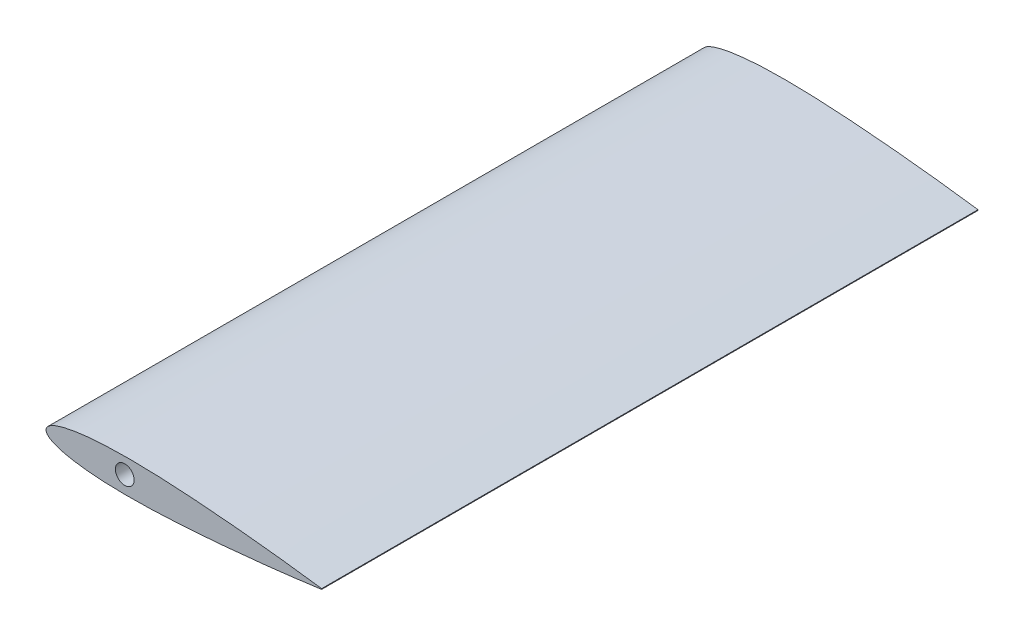
ISO-10303-21;
HEADER;
FILE_DESCRIPTION(('STEP AP214'),'2;1');
FILE_NAME('part.step','',(''),(''),'','','');
FILE_SCHEMA(('AUTOMOTIVE_DESIGN { 1 0 10303 214 1 1 1 1 }'));
ENDSEC;
DATA;
#1=APPLICATION_CONTEXT('core data for automotive mechanical design processes');
#2=APPLICATION_PROTOCOL_DEFINITION('international standard','automotive_design',2000,#1);
#3=PRODUCT_CONTEXT('',#1,'mechanical');
#4=PRODUCT('Part','Part','',(#3));
#5=PRODUCT_RELATED_PRODUCT_CATEGORY('part','',(#4));
#6=PRODUCT_DEFINITION_FORMATION('','',#4);
#7=PRODUCT_DEFINITION_CONTEXT('part definition',#1,'design');
#8=PRODUCT_DEFINITION('design','',#6,#7);
#9=PRODUCT_DEFINITION_SHAPE('','',#8);
#10=(LENGTH_UNIT() NAMED_UNIT(*) SI_UNIT(.MILLI.,.METRE.));
#11=(NAMED_UNIT(*) PLANE_ANGLE_UNIT() SI_UNIT($,.RADIAN.));
#12=(NAMED_UNIT(*) SI_UNIT($,.STERADIAN.) SOLID_ANGLE_UNIT());
#13=UNCERTAINTY_MEASURE_WITH_UNIT(LENGTH_MEASURE(1.E-05),#10,'distance_accuracy_value','');
#14=(GEOMETRIC_REPRESENTATION_CONTEXT(3) GLOBAL_UNCERTAINTY_ASSIGNED_CONTEXT((#13)) GLOBAL_UNIT_ASSIGNED_CONTEXT((#10,
#11,#12)) REPRESENTATION_CONTEXT('',''));
#15=CARTESIAN_POINT('',(0.,0.,0.));
#16=DIRECTION('',(0.,0.,1.));
#17=DIRECTION('',(1.,0.,0.));
#18=AXIS2_PLACEMENT_3D('',#15,#16,#17);
#19=CARTESIAN_POINT('',(0.999999999999996,-0.030492,70.));
#20=CARTESIAN_POINT('',(0.439107200362805,0.0482916430037762,70.));
#21=CARTESIAN_POINT('',(-1.67440318546743,0.334004631039862,70.));
#22=CARTESIAN_POINT('',(-4.61753075382217,0.68424044281171,70.));
#23=CARTESIAN_POINT('',(-8.13265648574757,1.04666058109571,70.));
#24=CARTESIAN_POINT('',(-10.7979695978863,1.28467991908706,70.));
#25=CARTESIAN_POINT('',(-13.3462125522033,1.47149098632113,70.));
#26=CARTESIAN_POINT('',(-15.4585233955373,1.59430214673583,70.));
#27=CARTESIAN_POINT('',(-17.5341249985783,1.67566708670534,70.));
#28=CARTESIAN_POINT('',(-19.5295919390187,1.70658812428436,70.));
#29=CARTESIAN_POINT('',(-21.218108072518,1.68277080165957,70.));
#30=CARTESIAN_POINT('',(-22.5984962646601,1.6201482803771,70.));
#31=CARTESIAN_POINT('',(-23.6814091095408,1.53967512026883,70.));
#32=CARTESIAN_POINT('',(-24.6713537677688,1.43217562844883,70.));
#33=CARTESIAN_POINT('',(-25.4326813593176,1.31828462141949,70.));
#34=CARTESIAN_POINT('',(-25.9876663950995,1.21315529065949,70.));
#35=CARTESIAN_POINT('',(-26.3624753496774,1.13107874990639,70.));
#36=CARTESIAN_POINT('',(-26.7077655636183,1.04362868292588,70.));
#37=CARTESIAN_POINT('',(-27.0227740532249,0.951196851540344,70.));
#38=CARTESIAN_POINT('',(-27.30680622529,0.854090221485334,70.));
#39=CARTESIAN_POINT('',(-27.5592563657164,0.752644177568336,70.));
#40=CARTESIAN_POINT('',(-27.779624737862,0.647151372552298,70.));
#41=CARTESIAN_POINT('',(-27.9674915113008,0.537831437340606,70.));
#42=CARTESIAN_POINT('',(-28.1226379229612,0.42486969062914,70.));
#43=CARTESIAN_POINT('',(-28.2447641879163,0.308080316766064,70.));
#44=CARTESIAN_POINT('',(-28.3335757952812,0.1871324708287,70.));
#45=CARTESIAN_POINT('',(-28.387875352133,0.0614349740101144,70.));
#46=CARTESIAN_POINT('',(-28.4059100610577,-0.0675360000000003,70.));
#47=CARTESIAN_POINT('',(-28.387875352133,-0.196506974010112,70.));
#48=CARTESIAN_POINT('',(-28.3335757952812,-0.322204470828704,70.));
#49=CARTESIAN_POINT('',(-28.2447641879163,-0.443152316766058,70.));
#50=CARTESIAN_POINT('',(-28.1226379229612,-0.559941690629147,70.));
#51=CARTESIAN_POINT('',(-27.9674915113008,-0.672903437340602,70.));
#52=CARTESIAN_POINT('',(-27.779624737862,-0.782223372552299,70.));
#53=CARTESIAN_POINT('',(-27.5592563657164,-0.887716177568338,70.));
#54=CARTESIAN_POINT('',(-27.30680622529,-0.989162221485334,70.));
#55=CARTESIAN_POINT('',(-27.0227740532249,-1.08626885154034,70.));
#56=CARTESIAN_POINT('',(-26.7077655636183,-1.17870068292588,70.));
#57=CARTESIAN_POINT('',(-26.3624753496774,-1.26615074990639,70.));
#58=CARTESIAN_POINT('',(-25.8453176345296,-1.37939915489957,70.));
#59=CARTESIAN_POINT('',(-25.1285876853691,-1.50394081739461,70.));
#60=CARTESIAN_POINT('',(-24.1885879902536,-1.62425936478125,70.));
#61=CARTESIAN_POINT('',(-22.9535044026313,-1.736332976136,70.));
#62=CARTESIAN_POINT('',(-21.4031558298524,-1.81515251551264,70.));
#63=CARTESIAN_POINT('',(-19.2995446770764,-1.84491037015484,70.));
#64=CARTESIAN_POINT('',(-17.0681292430447,-1.79876702122128,70.));
#65=CARTESIAN_POINT('',(-14.7563271985331,-1.69255987178564,70.));
#66=CARTESIAN_POINT('',(-12.6416051474833,-1.55811383616586,70.));
#67=CARTESIAN_POINT('',(-10.3295124754579,-1.37861378181494,70.));
#68=CARTESIAN_POINT('',(-8.30351639758221,-1.19440739049765,70.));
#69=CARTESIAN_POINT('',(-5.69237571783539,-0.932615266100081,70.));
#70=CARTESIAN_POINT('',(-3.10979309525262,-0.643787719924702,70.));
#71=CARTESIAN_POINT('',(-0.644324125665286,-0.330601025685573,70.));
#72=CARTESIAN_POINT('',(0.586969476350031,-0.162396473693552,70.));
#73=CARTESIAN_POINT('',(0.948583439323904,-0.111802028814434,70.));
#74=CARTESIAN_POINT('',(0.999999999999996,-0.10458,70.));
#75=B_SPLINE_CURVE_WITH_KNOTS('',3,(#19,#20,#21,#22,#23,#24,#25,#26,#27,#28,#29,#30,#31,#32,#33,
#34,#35,#36,#37,#38,#39,#40,#41,#42,#43,#44,#45,#46,#47,#48,#49,#50,#51,#52,#53,#54,#55,#56,#57,
#58,#59,#60,#61,#62,#63,#64,#65,#66,#67,#68,#69,#70,#71,#72,#73,#74),.UNSPECIFIED.,.F.,.F.,(4,1,
1,1,1,1,1,1,1,1,1,1,1,1,1,1,1,1,1,1,1,1,1,1,1,1,1,1,1,1,1,1,1,1,1,1,1,1,1,1,1,1,1,1,1,1,1,1,1,1,
1,1,1,4),(0.,0.0283429008690872,0.106722048517726,0.148306054540842,0.205171366742429,
0.240621400483931,0.276160573352716,0.311047092160121,0.344559265520828,0.376017570419826,
0.395537658905913,0.413698812078543,0.430349273099823,0.445356904422305,0.452209372098903,
0.458611567079498,0.46455404405062,0.470029850192537,0.475034902370301,0.479569141493347,
0.483636857140142,0.487250262770083,0.490431337960153,0.493218828079602,0.495674085869199,
0.497891368316545,0.5,0.502108631683455,0.504325914130801,0.506781171920398,0.509568662039847,
0.512749737229918,0.516363142859858,0.520430858506654,0.524965097629699,0.529970149807464,
0.53544595594938,0.541388432920502,0.547790627901097,0.561933980705176,0.577778558712574,
0.595202023801781,0.623982429580175,0.655440734479173,0.700464146399425,0.735649712925285,
0.771241831243212,0.806495956538878,0.851693945459158,0.873039495246583,0.937813387298575,
0.981728387914688,0.997401830647112,1.),.UNSPECIFIED.);
#76=DIRECTION('',(0.,0.,-1.));
#77=VECTOR('',#76,1.);
#78=SURFACE_OF_LINEAR_EXTRUSION('',#75,#77);
#79=CARTESIAN_POINT('',(0.999999999999996,-0.030492,0.));
#80=CARTESIAN_POINT('',(0.439107200362805,0.0482916430037762,0.));
#81=CARTESIAN_POINT('',(-1.67440318546743,0.334004631039862,0.));
#82=CARTESIAN_POINT('',(-4.61753075382217,0.68424044281171,0.));
#83=CARTESIAN_POINT('',(-8.13265648574757,1.04666058109571,0.));
#84=CARTESIAN_POINT('',(-10.7979695978863,1.28467991908706,0.));
#85=CARTESIAN_POINT('',(-13.3462125522033,1.47149098632113,0.));
#86=CARTESIAN_POINT('',(-15.4585233955373,1.59430214673583,0.));
#87=CARTESIAN_POINT('',(-17.5341249985783,1.67566708670534,0.));
#88=CARTESIAN_POINT('',(-19.5295919390187,1.70658812428436,0.));
#89=CARTESIAN_POINT('',(-21.218108072518,1.68277080165957,0.));
#90=CARTESIAN_POINT('',(-22.5984962646601,1.6201482803771,0.));
#91=CARTESIAN_POINT('',(-23.6814091095408,1.53967512026883,0.));
#92=CARTESIAN_POINT('',(-24.6713537677688,1.43217562844883,0.));
#93=CARTESIAN_POINT('',(-25.4326813593176,1.31828462141949,0.));
#94=CARTESIAN_POINT('',(-25.9876663950995,1.21315529065949,0.));
#95=CARTESIAN_POINT('',(-26.3624753496774,1.13107874990639,0.));
#96=CARTESIAN_POINT('',(-26.7077655636183,1.04362868292588,0.));
#97=CARTESIAN_POINT('',(-27.0227740532249,0.951196851540344,0.));
#98=CARTESIAN_POINT('',(-27.30680622529,0.854090221485334,0.));
#99=CARTESIAN_POINT('',(-27.5592563657164,0.752644177568336,0.));
#100=CARTESIAN_POINT('',(-27.779624737862,0.647151372552298,0.));
#101=CARTESIAN_POINT('',(-27.9674915113008,0.537831437340606,0.));
#102=CARTESIAN_POINT('',(-28.1226379229612,0.42486969062914,0.));
#103=CARTESIAN_POINT('',(-28.2447641879163,0.308080316766064,0.));
#104=CARTESIAN_POINT('',(-28.3335757952812,0.1871324708287,0.));
#105=CARTESIAN_POINT('',(-28.387875352133,0.0614349740101144,0.));
#106=CARTESIAN_POINT('',(-28.4059100610577,-0.0675360000000003,0.));
#107=CARTESIAN_POINT('',(-28.387875352133,-0.196506974010112,0.));
#108=CARTESIAN_POINT('',(-28.3335757952812,-0.322204470828704,0.));
#109=CARTESIAN_POINT('',(-28.2447641879163,-0.443152316766058,0.));
#110=CARTESIAN_POINT('',(-28.1226379229612,-0.559941690629147,0.));
#111=CARTESIAN_POINT('',(-27.9674915113008,-0.672903437340602,0.));
#112=CARTESIAN_POINT('',(-27.779624737862,-0.782223372552299,0.));
#113=CARTESIAN_POINT('',(-27.5592563657164,-0.887716177568338,0.));
#114=CARTESIAN_POINT('',(-27.30680622529,-0.989162221485334,0.));
#115=CARTESIAN_POINT('',(-27.0227740532249,-1.08626885154034,0.));
#116=CARTESIAN_POINT('',(-26.7077655636183,-1.17870068292588,0.));
#117=CARTESIAN_POINT('',(-26.3624753496774,-1.26615074990639,0.));
#118=CARTESIAN_POINT('',(-25.8453176345296,-1.37939915489957,0.));
#119=CARTESIAN_POINT('',(-25.1285876853691,-1.50394081739461,0.));
#120=CARTESIAN_POINT('',(-24.1885879902536,-1.62425936478125,0.));
#121=CARTESIAN_POINT('',(-22.9535044026313,-1.736332976136,0.));
#122=CARTESIAN_POINT('',(-21.4031558298524,-1.81515251551264,0.));
#123=CARTESIAN_POINT('',(-19.2995446770764,-1.84491037015484,0.));
#124=CARTESIAN_POINT('',(-17.0681292430447,-1.79876702122128,0.));
#125=CARTESIAN_POINT('',(-14.7563271985331,-1.69255987178564,0.));
#126=CARTESIAN_POINT('',(-12.6416051474833,-1.55811383616586,0.));
#127=CARTESIAN_POINT('',(-10.3295124754579,-1.37861378181494,0.));
#128=CARTESIAN_POINT('',(-8.30351639758221,-1.19440739049765,0.));
#129=CARTESIAN_POINT('',(-5.69237571783539,-0.932615266100081,0.));
#130=CARTESIAN_POINT('',(-3.10979309525262,-0.643787719924702,0.));
#131=CARTESIAN_POINT('',(-0.644324125665286,-0.330601025685573,0.));
#132=CARTESIAN_POINT('',(0.586969476350031,-0.162396473693552,0.));
#133=CARTESIAN_POINT('',(0.948583439323904,-0.111802028814434,0.));
#134=CARTESIAN_POINT('',(0.999999999999996,-0.10458,0.));
#135=B_SPLINE_CURVE_WITH_KNOTS('',3,(#79,#80,#81,#82,#83,#84,#85,#86,#87,#88,#89,#90,#91,#92,
#93,#94,#95,#96,#97,#98,#99,#100,#101,#102,#103,#104,#105,#106,#107,#108,#109,#110,#111,#112,
#113,#114,#115,#116,#117,#118,#119,#120,#121,#122,#123,#124,#125,#126,#127,#128,#129,#130,#131,
#132,#133,#134),.UNSPECIFIED.,.F.,.F.,(4,1,1,1,1,1,1,1,1,1,1,1,1,1,1,1,1,1,1,1,1,1,1,1,1,1,1,1,
1,1,1,1,1,1,1,1,1,1,1,1,1,1,1,1,1,1,1,1,1,1,1,1,1,4),(0.,0.0283429008690872,0.106722048517726,
0.148306054540842,0.205171366742429,0.240621400483931,0.276160573352716,0.311047092160121,
0.344559265520828,0.376017570419826,0.395537658905913,0.413698812078543,0.430349273099823,
0.445356904422305,0.452209372098903,0.458611567079498,0.46455404405062,0.470029850192537,
0.475034902370301,0.479569141493347,0.483636857140142,0.487250262770083,0.490431337960153,
0.493218828079602,0.495674085869199,0.497891368316545,0.5,0.502108631683455,0.504325914130801,
0.506781171920398,0.509568662039847,0.512749737229918,0.516363142859858,0.520430858506654,
0.524965097629699,0.529970149807464,0.53544595594938,0.541388432920502,0.547790627901097,
0.561933980705176,0.577778558712574,0.595202023801781,0.623982429580175,0.655440734479173,
0.700464146399425,0.735649712925285,0.771241831243212,0.806495956538878,0.851693945459158,
0.873039495246583,0.937813387298575,0.981728387914688,0.997401830647112,1.),.UNSPECIFIED.);
#136=CARTESIAN_POINT('',(0.999999999999996,-0.030492,0.));
#137=VERTEX_POINT('',#136);
#138=CARTESIAN_POINT('',(0.999999999999996,-0.10458,0.));
#139=VERTEX_POINT('',#138);
#140=EDGE_CURVE('E67',#137,#139,#135,.T.);
#141=ORIENTED_EDGE('',*,*,#140,.T.);
#142=DIRECTION('',(0.,0.,-1.));
#143=VECTOR('',#142,1.);
#144=CARTESIAN_POINT('',(0.999999999999996,-0.10458,70.));
#145=LINE('',#144,#143);
#146=CARTESIAN_POINT('',(0.999999999999996,-0.10458,70.));
#147=VERTEX_POINT('',#146);
#148=EDGE_CURVE('E11',#147,#139,#145,.T.);
#149=ORIENTED_EDGE('',*,*,#148,.F.);
#150=CARTESIAN_POINT('',(0.999999999999996,-0.030492,70.));
#151=VERTEX_POINT('',#150);
#152=EDGE_CURVE('E66',#151,#147,#75,.T.);
#153=ORIENTED_EDGE('',*,*,#152,.F.);
#154=DIRECTION('',(0.,0.,-1.));
#155=VECTOR('',#154,1.);
#156=CARTESIAN_POINT('',(0.999999999999996,-0.030492,70.));
#157=LINE('',#156,#155);
#158=EDGE_CURVE('E44',#151,#137,#157,.T.);
#159=ORIENTED_EDGE('',*,*,#158,.T.);
#160=EDGE_LOOP('',(#141,#149,#153,#159));
#161=FACE_BOUND('',#160,.T.);
#162=ADVANCED_FACE('F35',(#161),#78,.F.);
#163=CARTESIAN_POINT('',(0.999999999999996,-0.10458,70.));
#164=DIRECTION('',(-1.,0.,0.));
#165=DIRECTION('',(0.,0.,1.));
#166=AXIS2_PLACEMENT_3D('',#163,#164,#165);
#167=PLANE('',#166);
#168=DIRECTION('',(0.,1.,0.));
#169=VECTOR('',#168,1.);
#170=CARTESIAN_POINT('',(0.999999999999996,-0.10458,0.));
#171=LINE('',#170,#169);
#172=EDGE_CURVE('E59',#139,#137,#171,.T.);
#173=ORIENTED_EDGE('',*,*,#172,.T.);
#174=ORIENTED_EDGE('',*,*,#158,.F.);
#175=DIRECTION('',(0.,1.,0.));
#176=VECTOR('',#175,1.);
#177=CARTESIAN_POINT('',(0.999999999999996,-0.10458,70.));
#178=LINE('',#177,#176);
#179=EDGE_CURVE('E51',#147,#151,#178,.T.);
#180=ORIENTED_EDGE('',*,*,#179,.F.);
#181=ORIENTED_EDGE('',*,*,#148,.T.);
#182=EDGE_LOOP('',(#173,#174,#180,#181));
#183=FACE_BOUND('',#182,.T.);
#184=ADVANCED_FACE('F62',(#183),#167,.F.);
#185=CARTESIAN_POINT('',(-28.4,-0.0675359999999933,70.));
#186=DIRECTION('',(0.,0.,-1.));
#187=DIRECTION('',(-1.,0.,0.));
#188=AXIS2_PLACEMENT_3D('',#185,#186,#187);
#189=PLANE('',#188);
#190=CARTESIAN_POINT('',(-20.,0.,70.));
#191=DIRECTION('',(0.,0.,1.));
#192=DIRECTION('',(1.,0.,0.));
#193=AXIS2_PLACEMENT_3D('',#190,#191,#192);
#194=CIRCLE('',#193,1.);
#195=CARTESIAN_POINT('',(-19.,0.,70.));
#196=VERTEX_POINT('',#195);
#197=EDGE_CURVE('E74',#196,#196,#194,.T.);
#198=ORIENTED_EDGE('',*,*,#197,.F.);
#199=EDGE_LOOP('',(#198));
#200=FACE_BOUND('',#199,.T.);
#201=ORIENTED_EDGE('',*,*,#152,.T.);
#202=ORIENTED_EDGE('',*,*,#179,.T.);
#203=EDGE_LOOP('',(#201,#202));
#204=FACE_BOUND('',#203,.T.);
#205=ADVANCED_FACE('F94',(#200,#204),#189,.F.);
#206=CARTESIAN_POINT('',(-28.4,-0.0675359999999933,0.));
#207=DIRECTION('',(0.,0.,-1.));
#208=DIRECTION('',(-1.,0.,0.));
#209=AXIS2_PLACEMENT_3D('',#206,#207,#208);
#210=PLANE('',#209);
#211=CARTESIAN_POINT('',(-20.,0.,0.));
#212=DIRECTION('',(0.,0.,1.));
#213=DIRECTION('',(1.,0.,0.));
#214=AXIS2_PLACEMENT_3D('',#211,#212,#213);
#215=CIRCLE('',#214,1.);
#216=CARTESIAN_POINT('',(-19.,0.,0.));
#217=VERTEX_POINT('',#216);
#218=EDGE_CURVE('E71',#217,#217,#215,.T.);
#219=ORIENTED_EDGE('',*,*,#218,.T.);
#220=EDGE_LOOP('',(#219));
#221=FACE_BOUND('',#220,.T.);
#222=ORIENTED_EDGE('',*,*,#140,.F.);
#223=ORIENTED_EDGE('',*,*,#172,.F.);
#224=EDGE_LOOP('',(#222,#223));
#225=FACE_BOUND('',#224,.T.);
#226=ADVANCED_FACE('F70',(#221,#225),#210,.T.);
#227=CARTESIAN_POINT('',(-20.,0.,0.));
#228=DIRECTION('',(0.,0.,1.));
#229=DIRECTION('',(1.,0.,0.));
#230=AXIS2_PLACEMENT_3D('',#227,#228,#229);
#231=CYLINDRICAL_SURFACE('',#230,1.);
#232=ORIENTED_EDGE('',*,*,#218,.F.);
#233=EDGE_LOOP('',(#232));
#234=FACE_BOUND('',#233,.T.);
#235=ORIENTED_EDGE('',*,*,#197,.T.);
#236=EDGE_LOOP('',(#235));
#237=FACE_BOUND('',#236,.T.);
#238=ADVANCED_FACE('F92',(#234,#237),#231,.F.);
#239=CLOSED_SHELL('',(#162,#184,#205,#226,#238));
#240=MANIFOLD_SOLID_BREP('B2',#239);
#241=ADVANCED_BREP_SHAPE_REPRESENTATION('',(#18,#240),#14);
#242=SHAPE_DEFINITION_REPRESENTATION(#9,#241);
ENDSEC;
END-ISO-10303-21;
